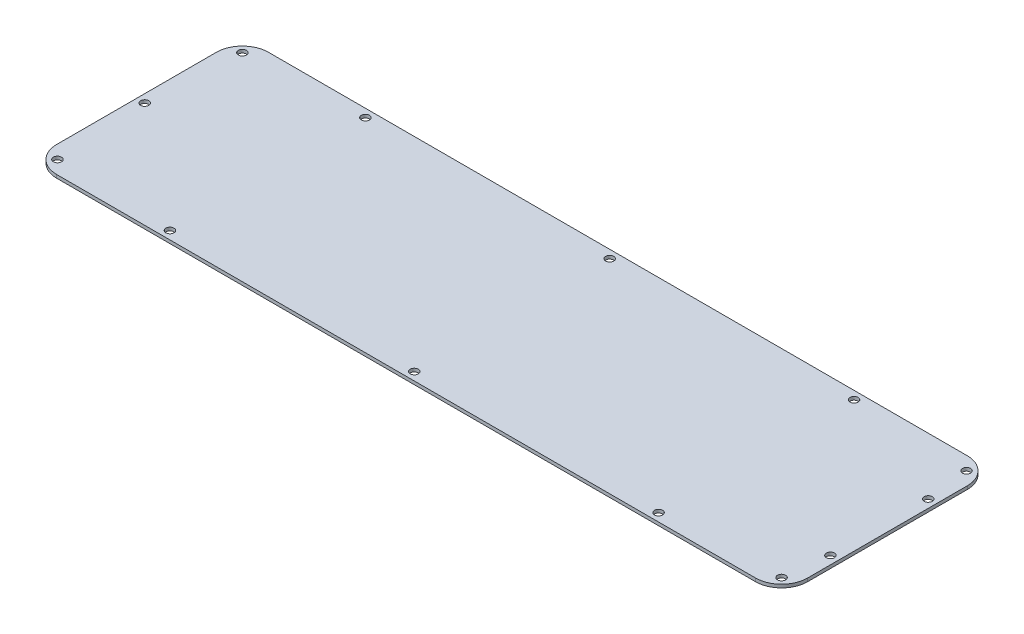
ISO-10303-21;
HEADER;
FILE_DESCRIPTION(('STEP AP214'),'2;1');
FILE_NAME('part.step','',(''),(''),'','','');
FILE_SCHEMA(('AUTOMOTIVE_DESIGN { 1 0 10303 214 1 1 1 1 }'));
ENDSEC;
DATA;
#1=APPLICATION_CONTEXT('core data for automotive mechanical design processes');
#2=APPLICATION_PROTOCOL_DEFINITION('international standard','automotive_design',2000,#1);
#3=PRODUCT_CONTEXT('',#1,'mechanical');
#4=PRODUCT('Part','Part','',(#3));
#5=PRODUCT_RELATED_PRODUCT_CATEGORY('part','',(#4));
#6=PRODUCT_DEFINITION_FORMATION('','',#4);
#7=PRODUCT_DEFINITION_CONTEXT('part definition',#1,'design');
#8=PRODUCT_DEFINITION('design','',#6,#7);
#9=PRODUCT_DEFINITION_SHAPE('','',#8);
#10=(LENGTH_UNIT() NAMED_UNIT(*) SI_UNIT(.MILLI.,.METRE.));
#11=(NAMED_UNIT(*) PLANE_ANGLE_UNIT() SI_UNIT($,.RADIAN.));
#12=(NAMED_UNIT(*) SI_UNIT($,.STERADIAN.) SOLID_ANGLE_UNIT());
#13=UNCERTAINTY_MEASURE_WITH_UNIT(LENGTH_MEASURE(1.E-05),#10,'distance_accuracy_value','');
#14=(GEOMETRIC_REPRESENTATION_CONTEXT(3) GLOBAL_UNCERTAINTY_ASSIGNED_CONTEXT((#13)) GLOBAL_UNIT_ASSIGNED_CONTEXT((#10,
#11,#12)) REPRESENTATION_CONTEXT('',''));
#15=CARTESIAN_POINT('',(0.,0.,0.));
#16=DIRECTION('',(0.,0.,1.));
#17=DIRECTION('',(1.,0.,0.));
#18=AXIS2_PLACEMENT_3D('',#15,#16,#17);
#19=CARTESIAN_POINT('',(230.5,2.,-65.));
#20=DIRECTION('',(-1.,0.,0.));
#21=DIRECTION('',(0.,0.,1.));
#22=AXIS2_PLACEMENT_3D('',#19,#20,#21);
#23=PLANE('',#22);
#24=DIRECTION('',(0.,0.,-1.));
#25=VECTOR('',#24,1.);
#26=CARTESIAN_POINT('',(230.5,0.,-65.));
#27=LINE('',#26,#25);
#28=CARTESIAN_POINT('',(230.5,0.,49.));
#29=VERTEX_POINT('',#28);
#30=CARTESIAN_POINT('',(230.5,0.,-49.));
#31=VERTEX_POINT('',#30);
#32=EDGE_CURVE('E133',#29,#31,#27,.T.);
#33=ORIENTED_EDGE('',*,*,#32,.T.);
#34=DIRECTION('',(0.,-1.,0.));
#35=VECTOR('',#34,1.);
#36=CARTESIAN_POINT('',(230.5,2.,-49.));
#37=LINE('',#36,#35);
#38=CARTESIAN_POINT('',(230.5,2.,-49.));
#39=VERTEX_POINT('',#38);
#40=EDGE_CURVE('E156',#31,#39,#37,.F.);
#41=ORIENTED_EDGE('',*,*,#40,.T.);
#42=DIRECTION('',(0.,0.,-1.));
#43=VECTOR('',#42,1.);
#44=CARTESIAN_POINT('',(230.5,2.,-65.));
#45=LINE('',#44,#43);
#46=CARTESIAN_POINT('',(230.5,2.,49.));
#47=VERTEX_POINT('',#46);
#48=EDGE_CURVE('E131',#47,#39,#45,.T.);
#49=ORIENTED_EDGE('',*,*,#48,.F.);
#50=DIRECTION('',(0.,-1.,0.));
#51=VECTOR('',#50,1.);
#52=CARTESIAN_POINT('',(230.5,2.,49.));
#53=LINE('',#52,#51);
#54=EDGE_CURVE('E153',#47,#29,#53,.T.);
#55=ORIENTED_EDGE('',*,*,#54,.T.);
#56=EDGE_LOOP('',(#33,#41,#49,#55));
#57=FACE_BOUND('',#56,.T.);
#58=ADVANCED_FACE('F38',(#57),#23,.F.);
#59=CARTESIAN_POINT('',(-230.5,2.,-65.));
#60=DIRECTION('',(0.,0.,1.));
#61=DIRECTION('',(1.,0.,0.));
#62=AXIS2_PLACEMENT_3D('',#59,#60,#61);
#63=PLANE('',#62);
#64=DIRECTION('',(-1.,0.,0.));
#65=VECTOR('',#64,1.);
#66=CARTESIAN_POINT('',(-230.5,0.,-65.));
#67=LINE('',#66,#65);
#68=CARTESIAN_POINT('',(214.5,0.,-65.));
#69=VERTEX_POINT('',#68);
#70=CARTESIAN_POINT('',(-214.5,0.,-65.));
#71=VERTEX_POINT('',#70);
#72=EDGE_CURVE('E129',#69,#71,#67,.T.);
#73=ORIENTED_EDGE('',*,*,#72,.T.);
#74=DIRECTION('',(0.,-1.,0.));
#75=VECTOR('',#74,1.);
#76=CARTESIAN_POINT('',(-214.5,2.,-65.));
#77=LINE('',#76,#75);
#78=CARTESIAN_POINT('',(-214.5,2.,-65.));
#79=VERTEX_POINT('',#78);
#80=EDGE_CURVE('E108',#71,#79,#77,.F.);
#81=ORIENTED_EDGE('',*,*,#80,.T.);
#82=DIRECTION('',(-1.,0.,0.));
#83=VECTOR('',#82,1.);
#84=CARTESIAN_POINT('',(-230.5,2.,-65.));
#85=LINE('',#84,#83);
#86=CARTESIAN_POINT('',(214.5,2.,-65.));
#87=VERTEX_POINT('',#86);
#88=EDGE_CURVE('E172',#87,#79,#85,.T.);
#89=ORIENTED_EDGE('',*,*,#88,.F.);
#90=DIRECTION('',(0.,-1.,0.));
#91=VECTOR('',#90,1.);
#92=CARTESIAN_POINT('',(214.5,2.,-65.));
#93=LINE('',#92,#91);
#94=EDGE_CURVE('E113',#87,#69,#93,.T.);
#95=ORIENTED_EDGE('',*,*,#94,.T.);
#96=EDGE_LOOP('',(#73,#81,#89,#95));
#97=FACE_BOUND('',#96,.T.);
#98=ADVANCED_FACE('F293',(#97),#63,.F.);
#99=CARTESIAN_POINT('',(-230.5,2.,-65.));
#100=DIRECTION('',(1.,0.,0.));
#101=DIRECTION('',(0.,0.,-1.));
#102=AXIS2_PLACEMENT_3D('',#99,#100,#101);
#103=PLANE('',#102);
#104=DIRECTION('',(0.,0.,1.));
#105=VECTOR('',#104,1.);
#106=CARTESIAN_POINT('',(-230.5,2.,-65.));
#107=LINE('',#106,#105);
#108=CARTESIAN_POINT('',(-230.5,2.,-49.));
#109=VERTEX_POINT('',#108);
#110=CARTESIAN_POINT('',(-230.5,2.,49.));
#111=VERTEX_POINT('',#110);
#112=EDGE_CURVE('E122',#109,#111,#107,.T.);
#113=ORIENTED_EDGE('',*,*,#112,.F.);
#114=DIRECTION('',(0.,-1.,0.));
#115=VECTOR('',#114,1.);
#116=CARTESIAN_POINT('',(-230.5,2.,-49.));
#117=LINE('',#116,#115);
#118=CARTESIAN_POINT('',(-230.5,0.,-49.));
#119=VERTEX_POINT('',#118);
#120=EDGE_CURVE('E107',#109,#119,#117,.T.);
#121=ORIENTED_EDGE('',*,*,#120,.T.);
#122=DIRECTION('',(0.,0.,1.));
#123=VECTOR('',#122,1.);
#124=CARTESIAN_POINT('',(-230.5,0.,-65.));
#125=LINE('',#124,#123);
#126=CARTESIAN_POINT('',(-230.5,0.,49.));
#127=VERTEX_POINT('',#126);
#128=EDGE_CURVE('E120',#119,#127,#125,.T.);
#129=ORIENTED_EDGE('',*,*,#128,.T.);
#130=DIRECTION('',(0.,-1.,0.));
#131=VECTOR('',#130,1.);
#132=CARTESIAN_POINT('',(-230.5,2.,49.));
#133=LINE('',#132,#131);
#134=EDGE_CURVE('E124',#127,#111,#133,.F.);
#135=ORIENTED_EDGE('',*,*,#134,.T.);
#136=EDGE_LOOP('',(#113,#121,#129,#135));
#137=FACE_BOUND('',#136,.T.);
#138=ADVANCED_FACE('F119',(#137),#103,.F.);
#139=CARTESIAN_POINT('',(-230.5,2.,65.));
#140=DIRECTION('',(0.,0.,-1.));
#141=DIRECTION('',(-1.,0.,0.));
#142=AXIS2_PLACEMENT_3D('',#139,#140,#141);
#143=PLANE('',#142);
#144=DIRECTION('',(1.,0.,0.));
#145=VECTOR('',#144,1.);
#146=CARTESIAN_POINT('',(-230.5,0.,65.));
#147=LINE('',#146,#145);
#148=CARTESIAN_POINT('',(-214.5,0.,65.));
#149=VERTEX_POINT('',#148);
#150=CARTESIAN_POINT('',(214.5,0.,65.));
#151=VERTEX_POINT('',#150);
#152=EDGE_CURVE('E128',#149,#151,#147,.T.);
#153=ORIENTED_EDGE('',*,*,#152,.T.);
#154=DIRECTION('',(0.,-1.,0.));
#155=VECTOR('',#154,1.);
#156=CARTESIAN_POINT('',(214.5,2.,65.));
#157=LINE('',#156,#155);
#158=CARTESIAN_POINT('',(214.5,2.,65.));
#159=VERTEX_POINT('',#158);
#160=EDGE_CURVE('E11',#151,#159,#157,.F.);
#161=ORIENTED_EDGE('',*,*,#160,.T.);
#162=DIRECTION('',(1.,0.,0.));
#163=VECTOR('',#162,1.);
#164=CARTESIAN_POINT('',(-230.5,2.,65.));
#165=LINE('',#164,#163);
#166=CARTESIAN_POINT('',(-214.5,2.,65.));
#167=VERTEX_POINT('',#166);
#168=EDGE_CURVE('E137',#167,#159,#165,.T.);
#169=ORIENTED_EDGE('',*,*,#168,.F.);
#170=DIRECTION('',(0.,-1.,0.));
#171=VECTOR('',#170,1.);
#172=CARTESIAN_POINT('',(-214.5,2.,65.));
#173=LINE('',#172,#171);
#174=EDGE_CURVE('E46',#167,#149,#173,.T.);
#175=ORIENTED_EDGE('',*,*,#174,.T.);
#176=EDGE_LOOP('',(#153,#161,#169,#175));
#177=FACE_BOUND('',#176,.T.);
#178=ADVANCED_FACE('F159',(#177),#143,.F.);
#179=CARTESIAN_POINT('',(0.,2.,0.));
#180=DIRECTION('',(0.,1.,0.));
#181=DIRECTION('',(0.,0.,1.));
#182=AXIS2_PLACEMENT_3D('',#179,#180,#181);
#183=PLANE('',#182);
#184=CARTESIAN_POINT('',(-222.278174593052,2.,-56.778174593052));
#185=DIRECTION('',(0.,1.,0.));
#186=DIRECTION('',(0.,0.,1.));
#187=AXIS2_PLACEMENT_3D('',#184,#185,#186);
#188=CIRCLE('',#187,2.5);
#189=CARTESIAN_POINT('',(-222.278174593052,2.,-54.278174593052));
#190=VERTEX_POINT('',#189);
#191=EDGE_CURVE('E258',#190,#190,#188,.T.);
#192=ORIENTED_EDGE('',*,*,#191,.F.);
#193=EDGE_LOOP('',(#192));
#194=FACE_BOUND('',#193,.T.);
#195=CARTESIAN_POINT('',(-150.,2.,-60.));
#196=DIRECTION('',(0.,1.,0.));
#197=DIRECTION('',(0.,0.,1.));
#198=AXIS2_PLACEMENT_3D('',#195,#196,#197);
#199=CIRCLE('',#198,2.5);
#200=CARTESIAN_POINT('',(-150.,2.,-57.5));
#201=VERTEX_POINT('',#200);
#202=EDGE_CURVE('E252',#201,#201,#199,.T.);
#203=ORIENTED_EDGE('',*,*,#202,.F.);
#204=EDGE_LOOP('',(#203));
#205=FACE_BOUND('',#204,.T.);
#206=CARTESIAN_POINT('',(-225.5,2.,0.));
#207=DIRECTION('',(0.,1.,0.));
#208=DIRECTION('',(0.,0.,1.));
#209=AXIS2_PLACEMENT_3D('',#206,#207,#208);
#210=CIRCLE('',#209,2.5);
#211=CARTESIAN_POINT('',(-225.5,2.,2.5));
#212=VERTEX_POINT('',#211);
#213=EDGE_CURVE('E246',#212,#212,#210,.T.);
#214=ORIENTED_EDGE('',*,*,#213,.F.);
#215=EDGE_LOOP('',(#214));
#216=FACE_BOUND('',#215,.T.);
#217=CARTESIAN_POINT('',(-222.278174593052,2.,56.7781745930521));
#218=DIRECTION('',(0.,1.,0.));
#219=DIRECTION('',(0.,0.,1.));
#220=AXIS2_PLACEMENT_3D('',#217,#218,#219);
#221=CIRCLE('',#220,2.5);
#222=CARTESIAN_POINT('',(-222.278174593052,2.,59.2781745930521));
#223=VERTEX_POINT('',#222);
#224=EDGE_CURVE('E240',#223,#223,#221,.T.);
#225=ORIENTED_EDGE('',*,*,#224,.F.);
#226=EDGE_LOOP('',(#225));
#227=FACE_BOUND('',#226,.T.);
#228=CARTESIAN_POINT('',(-150.,2.,60.));
#229=DIRECTION('',(0.,1.,0.));
#230=DIRECTION('',(0.,0.,1.));
#231=AXIS2_PLACEMENT_3D('',#228,#229,#230);
#232=CIRCLE('',#231,2.5);
#233=CARTESIAN_POINT('',(-150.,2.,62.5));
#234=VERTEX_POINT('',#233);
#235=EDGE_CURVE('E234',#234,#234,#232,.T.);
#236=ORIENTED_EDGE('',*,*,#235,.F.);
#237=EDGE_LOOP('',(#236));
#238=FACE_BOUND('',#237,.T.);
#239=CARTESIAN_POINT('',(0.,2.,-60.));
#240=DIRECTION('',(0.,1.,0.));
#241=DIRECTION('',(0.,0.,1.));
#242=AXIS2_PLACEMENT_3D('',#239,#240,#241);
#243=CIRCLE('',#242,2.5);
#244=CARTESIAN_POINT('',(0.,2.,-57.5));
#245=VERTEX_POINT('',#244);
#246=EDGE_CURVE('E228',#245,#245,#243,.T.);
#247=ORIENTED_EDGE('',*,*,#246,.F.);
#248=EDGE_LOOP('',(#247));
#249=FACE_BOUND('',#248,.T.);
#250=CARTESIAN_POINT('',(0.,2.,60.));
#251=DIRECTION('',(0.,1.,0.));
#252=DIRECTION('',(0.,0.,1.));
#253=AXIS2_PLACEMENT_3D('',#250,#251,#252);
#254=CIRCLE('',#253,2.5);
#255=CARTESIAN_POINT('',(0.,2.,62.5));
#256=VERTEX_POINT('',#255);
#257=EDGE_CURVE('E222',#256,#256,#254,.T.);
#258=ORIENTED_EDGE('',*,*,#257,.F.);
#259=EDGE_LOOP('',(#258));
#260=FACE_BOUND('',#259,.T.);
#261=CARTESIAN_POINT('',(150.,2.,60.));
#262=DIRECTION('',(0.,1.,0.));
#263=DIRECTION('',(0.,0.,1.));
#264=AXIS2_PLACEMENT_3D('',#261,#262,#263);
#265=CIRCLE('',#264,2.5);
#266=CARTESIAN_POINT('',(150.,2.,62.5));
#267=VERTEX_POINT('',#266);
#268=EDGE_CURVE('E216',#267,#267,#265,.T.);
#269=ORIENTED_EDGE('',*,*,#268,.F.);
#270=EDGE_LOOP('',(#269));
#271=FACE_BOUND('',#270,.T.);
#272=CARTESIAN_POINT('',(150.,2.,-60.));
#273=DIRECTION('',(0.,1.,0.));
#274=DIRECTION('',(0.,0.,1.));
#275=AXIS2_PLACEMENT_3D('',#272,#273,#274);
#276=CIRCLE('',#275,2.5);
#277=CARTESIAN_POINT('',(150.,2.,-57.5));
#278=VERTEX_POINT('',#277);
#279=EDGE_CURVE('E210',#278,#278,#276,.T.);
#280=ORIENTED_EDGE('',*,*,#279,.F.);
#281=EDGE_LOOP('',(#280));
#282=FACE_BOUND('',#281,.T.);
#283=CARTESIAN_POINT('',(222.278174593052,2.,-56.778174593052));
#284=DIRECTION('',(0.,1.,0.));
#285=DIRECTION('',(0.,0.,1.));
#286=AXIS2_PLACEMENT_3D('',#283,#284,#285);
#287=CIRCLE('',#286,2.5);
#288=CARTESIAN_POINT('',(222.278174593052,2.,-54.278174593052));
#289=VERTEX_POINT('',#288);
#290=EDGE_CURVE('E204',#289,#289,#287,.T.);
#291=ORIENTED_EDGE('',*,*,#290,.F.);
#292=EDGE_LOOP('',(#291));
#293=FACE_BOUND('',#292,.T.);
#294=CARTESIAN_POINT('',(222.278174593052,2.,56.7781745930521));
#295=DIRECTION('',(0.,1.,0.));
#296=DIRECTION('',(0.,0.,1.));
#297=AXIS2_PLACEMENT_3D('',#294,#295,#296);
#298=CIRCLE('',#297,2.5);
#299=CARTESIAN_POINT('',(222.278174593052,2.,59.2781745930521));
#300=VERTEX_POINT('',#299);
#301=EDGE_CURVE('E198',#300,#300,#298,.T.);
#302=ORIENTED_EDGE('',*,*,#301,.F.);
#303=EDGE_LOOP('',(#302));
#304=FACE_BOUND('',#303,.T.);
#305=CARTESIAN_POINT('',(225.5,2.,-30.0000000000001));
#306=DIRECTION('',(0.,1.,0.));
#307=DIRECTION('',(0.,0.,1.));
#308=AXIS2_PLACEMENT_3D('',#305,#306,#307);
#309=CIRCLE('',#308,2.5);
#310=CARTESIAN_POINT('',(225.5,2.,-27.5000000000001));
#311=VERTEX_POINT('',#310);
#312=EDGE_CURVE('E190',#311,#311,#309,.T.);
#313=ORIENTED_EDGE('',*,*,#312,.F.);
#314=EDGE_LOOP('',(#313));
#315=FACE_BOUND('',#314,.T.);
#316=CARTESIAN_POINT('',(225.5,2.,30.));
#317=DIRECTION('',(0.,1.,0.));
#318=DIRECTION('',(0.,0.,1.));
#319=AXIS2_PLACEMENT_3D('',#316,#317,#318);
#320=CIRCLE('',#319,2.5);
#321=CARTESIAN_POINT('',(225.5,2.,32.5));
#322=VERTEX_POINT('',#321);
#323=EDGE_CURVE('E182',#322,#322,#320,.T.);
#324=ORIENTED_EDGE('',*,*,#323,.F.);
#325=EDGE_LOOP('',(#324));
#326=FACE_BOUND('',#325,.T.);
#327=ORIENTED_EDGE('',*,*,#88,.T.);
#328=CARTESIAN_POINT('',(-214.5,2.,-49.));
#329=DIRECTION('',(0.,1.,0.));
#330=DIRECTION('',(0.,0.,1.));
#331=AXIS2_PLACEMENT_3D('',#328,#329,#330);
#332=CIRCLE('',#331,16.);
#333=EDGE_CURVE('E151',#79,#109,#332,.T.);
#334=ORIENTED_EDGE('',*,*,#333,.T.);
#335=ORIENTED_EDGE('',*,*,#112,.T.);
#336=CARTESIAN_POINT('',(-214.5,2.,49.));
#337=DIRECTION('',(0.,1.,0.));
#338=DIRECTION('',(0.,0.,1.));
#339=AXIS2_PLACEMENT_3D('',#336,#337,#338);
#340=CIRCLE('',#339,16.);
#341=EDGE_CURVE('E58',#111,#167,#340,.T.);
#342=ORIENTED_EDGE('',*,*,#341,.T.);
#343=ORIENTED_EDGE('',*,*,#168,.T.);
#344=CARTESIAN_POINT('',(214.5,2.,49.));
#345=DIRECTION('',(0.,1.,0.));
#346=DIRECTION('',(0.,0.,1.));
#347=AXIS2_PLACEMENT_3D('',#344,#345,#346);
#348=CIRCLE('',#347,16.);
#349=EDGE_CURVE('E147',#159,#47,#348,.T.);
#350=ORIENTED_EDGE('',*,*,#349,.T.);
#351=ORIENTED_EDGE('',*,*,#48,.T.);
#352=CARTESIAN_POINT('',(214.5,2.,-49.));
#353=DIRECTION('',(0.,1.,0.));
#354=DIRECTION('',(0.,0.,1.));
#355=AXIS2_PLACEMENT_3D('',#352,#353,#354);
#356=CIRCLE('',#355,16.);
#357=EDGE_CURVE('E149',#39,#87,#356,.T.);
#358=ORIENTED_EDGE('',*,*,#357,.T.);
#359=EDGE_LOOP('',(#327,#334,#335,#342,#343,#350,#351,#358));
#360=FACE_BOUND('',#359,.T.);
#361=ADVANCED_FACE('F264',(#194,#205,#216,#227,#238,#249,#260,#271,#282,#293,#304,#315,#326,
#360),#183,.T.);
#362=CARTESIAN_POINT('',(0.,0.,0.));
#363=DIRECTION('',(0.,1.,0.));
#364=DIRECTION('',(0.,0.,1.));
#365=AXIS2_PLACEMENT_3D('',#362,#363,#364);
#366=PLANE('',#365);
#367=CARTESIAN_POINT('',(-222.278174593052,0.,-56.778174593052));
#368=DIRECTION('',(0.,1.,0.));
#369=DIRECTION('',(0.,0.,1.));
#370=AXIS2_PLACEMENT_3D('',#367,#368,#369);
#371=CIRCLE('',#370,2.5);
#372=CARTESIAN_POINT('',(-222.278174593052,0.,-54.278174593052));
#373=VERTEX_POINT('',#372);
#374=EDGE_CURVE('E255',#373,#373,#371,.T.);
#375=ORIENTED_EDGE('',*,*,#374,.T.);
#376=EDGE_LOOP('',(#375));
#377=FACE_BOUND('',#376,.T.);
#378=CARTESIAN_POINT('',(-150.,0.,-60.));
#379=DIRECTION('',(0.,1.,0.));
#380=DIRECTION('',(0.,0.,1.));
#381=AXIS2_PLACEMENT_3D('',#378,#379,#380);
#382=CIRCLE('',#381,2.5);
#383=CARTESIAN_POINT('',(-150.,0.,-57.5));
#384=VERTEX_POINT('',#383);
#385=EDGE_CURVE('E249',#384,#384,#382,.T.);
#386=ORIENTED_EDGE('',*,*,#385,.T.);
#387=EDGE_LOOP('',(#386));
#388=FACE_BOUND('',#387,.T.);
#389=CARTESIAN_POINT('',(-225.5,0.,0.));
#390=DIRECTION('',(0.,1.,0.));
#391=DIRECTION('',(0.,0.,1.));
#392=AXIS2_PLACEMENT_3D('',#389,#390,#391);
#393=CIRCLE('',#392,2.5);
#394=CARTESIAN_POINT('',(-225.5,0.,2.5));
#395=VERTEX_POINT('',#394);
#396=EDGE_CURVE('E243',#395,#395,#393,.T.);
#397=ORIENTED_EDGE('',*,*,#396,.T.);
#398=EDGE_LOOP('',(#397));
#399=FACE_BOUND('',#398,.T.);
#400=CARTESIAN_POINT('',(-222.278174593052,0.,56.7781745930521));
#401=DIRECTION('',(0.,1.,0.));
#402=DIRECTION('',(0.,0.,1.));
#403=AXIS2_PLACEMENT_3D('',#400,#401,#402);
#404=CIRCLE('',#403,2.5);
#405=CARTESIAN_POINT('',(-222.278174593052,0.,59.2781745930521));
#406=VERTEX_POINT('',#405);
#407=EDGE_CURVE('E237',#406,#406,#404,.T.);
#408=ORIENTED_EDGE('',*,*,#407,.T.);
#409=EDGE_LOOP('',(#408));
#410=FACE_BOUND('',#409,.T.);
#411=CARTESIAN_POINT('',(-150.,0.,60.));
#412=DIRECTION('',(0.,1.,0.));
#413=DIRECTION('',(0.,0.,1.));
#414=AXIS2_PLACEMENT_3D('',#411,#412,#413);
#415=CIRCLE('',#414,2.5);
#416=CARTESIAN_POINT('',(-150.,0.,62.5));
#417=VERTEX_POINT('',#416);
#418=EDGE_CURVE('E231',#417,#417,#415,.T.);
#419=ORIENTED_EDGE('',*,*,#418,.T.);
#420=EDGE_LOOP('',(#419));
#421=FACE_BOUND('',#420,.T.);
#422=CARTESIAN_POINT('',(0.,0.,-60.));
#423=DIRECTION('',(0.,1.,0.));
#424=DIRECTION('',(0.,0.,1.));
#425=AXIS2_PLACEMENT_3D('',#422,#423,#424);
#426=CIRCLE('',#425,2.5);
#427=CARTESIAN_POINT('',(0.,0.,-57.5));
#428=VERTEX_POINT('',#427);
#429=EDGE_CURVE('E225',#428,#428,#426,.T.);
#430=ORIENTED_EDGE('',*,*,#429,.T.);
#431=EDGE_LOOP('',(#430));
#432=FACE_BOUND('',#431,.T.);
#433=CARTESIAN_POINT('',(0.,0.,60.));
#434=DIRECTION('',(0.,1.,0.));
#435=DIRECTION('',(0.,0.,1.));
#436=AXIS2_PLACEMENT_3D('',#433,#434,#435);
#437=CIRCLE('',#436,2.5);
#438=CARTESIAN_POINT('',(0.,0.,62.5));
#439=VERTEX_POINT('',#438);
#440=EDGE_CURVE('E219',#439,#439,#437,.T.);
#441=ORIENTED_EDGE('',*,*,#440,.T.);
#442=EDGE_LOOP('',(#441));
#443=FACE_BOUND('',#442,.T.);
#444=CARTESIAN_POINT('',(150.,0.,60.));
#445=DIRECTION('',(0.,1.,0.));
#446=DIRECTION('',(0.,0.,1.));
#447=AXIS2_PLACEMENT_3D('',#444,#445,#446);
#448=CIRCLE('',#447,2.5);
#449=CARTESIAN_POINT('',(150.,0.,62.5));
#450=VERTEX_POINT('',#449);
#451=EDGE_CURVE('E213',#450,#450,#448,.T.);
#452=ORIENTED_EDGE('',*,*,#451,.T.);
#453=EDGE_LOOP('',(#452));
#454=FACE_BOUND('',#453,.T.);
#455=CARTESIAN_POINT('',(150.,0.,-60.));
#456=DIRECTION('',(0.,1.,0.));
#457=DIRECTION('',(0.,0.,1.));
#458=AXIS2_PLACEMENT_3D('',#455,#456,#457);
#459=CIRCLE('',#458,2.5);
#460=CARTESIAN_POINT('',(150.,0.,-57.5));
#461=VERTEX_POINT('',#460);
#462=EDGE_CURVE('E207',#461,#461,#459,.T.);
#463=ORIENTED_EDGE('',*,*,#462,.T.);
#464=EDGE_LOOP('',(#463));
#465=FACE_BOUND('',#464,.T.);
#466=CARTESIAN_POINT('',(222.278174593052,0.,-56.778174593052));
#467=DIRECTION('',(0.,1.,0.));
#468=DIRECTION('',(0.,0.,1.));
#469=AXIS2_PLACEMENT_3D('',#466,#467,#468);
#470=CIRCLE('',#469,2.5);
#471=CARTESIAN_POINT('',(222.278174593052,0.,-54.278174593052));
#472=VERTEX_POINT('',#471);
#473=EDGE_CURVE('E201',#472,#472,#470,.T.);
#474=ORIENTED_EDGE('',*,*,#473,.T.);
#475=EDGE_LOOP('',(#474));
#476=FACE_BOUND('',#475,.T.);
#477=CARTESIAN_POINT('',(222.278174593052,0.,56.7781745930521));
#478=DIRECTION('',(0.,1.,0.));
#479=DIRECTION('',(0.,0.,1.));
#480=AXIS2_PLACEMENT_3D('',#477,#478,#479);
#481=CIRCLE('',#480,2.5);
#482=CARTESIAN_POINT('',(222.278174593052,0.,59.2781745930521));
#483=VERTEX_POINT('',#482);
#484=EDGE_CURVE('E195',#483,#483,#481,.T.);
#485=ORIENTED_EDGE('',*,*,#484,.T.);
#486=EDGE_LOOP('',(#485));
#487=FACE_BOUND('',#486,.T.);
#488=CARTESIAN_POINT('',(225.5,0.,-30.0000000000001));
#489=DIRECTION('',(0.,1.,0.));
#490=DIRECTION('',(0.,0.,1.));
#491=AXIS2_PLACEMENT_3D('',#488,#489,#490);
#492=CIRCLE('',#491,2.5);
#493=CARTESIAN_POINT('',(225.5,0.,-27.5000000000001));
#494=VERTEX_POINT('',#493);
#495=EDGE_CURVE('E186',#494,#494,#492,.T.);
#496=ORIENTED_EDGE('',*,*,#495,.T.);
#497=EDGE_LOOP('',(#496));
#498=FACE_BOUND('',#497,.T.);
#499=CARTESIAN_POINT('',(225.5,0.,30.));
#500=DIRECTION('',(0.,1.,0.));
#501=DIRECTION('',(0.,0.,1.));
#502=AXIS2_PLACEMENT_3D('',#499,#500,#501);
#503=CIRCLE('',#502,2.5);
#504=CARTESIAN_POINT('',(225.5,0.,32.5));
#505=VERTEX_POINT('',#504);
#506=EDGE_CURVE('E177',#505,#505,#503,.T.);
#507=ORIENTED_EDGE('',*,*,#506,.T.);
#508=EDGE_LOOP('',(#507));
#509=FACE_BOUND('',#508,.T.);
#510=ORIENTED_EDGE('',*,*,#128,.F.);
#511=CARTESIAN_POINT('',(-214.5,0.,-49.));
#512=DIRECTION('',(0.,1.,0.));
#513=DIRECTION('',(0.,0.,1.));
#514=AXIS2_PLACEMENT_3D('',#511,#512,#513);
#515=CIRCLE('',#514,16.);
#516=EDGE_CURVE('E103',#119,#71,#515,.F.);
#517=ORIENTED_EDGE('',*,*,#516,.T.);
#518=ORIENTED_EDGE('',*,*,#72,.F.);
#519=CARTESIAN_POINT('',(214.5,0.,-49.));
#520=DIRECTION('',(0.,1.,0.));
#521=DIRECTION('',(0.,0.,1.));
#522=AXIS2_PLACEMENT_3D('',#519,#520,#521);
#523=CIRCLE('',#522,16.);
#524=EDGE_CURVE('E114',#69,#31,#523,.F.);
#525=ORIENTED_EDGE('',*,*,#524,.T.);
#526=ORIENTED_EDGE('',*,*,#32,.F.);
#527=CARTESIAN_POINT('',(214.5,0.,49.));
#528=DIRECTION('',(0.,1.,0.));
#529=DIRECTION('',(0.,0.,1.));
#530=AXIS2_PLACEMENT_3D('',#527,#528,#529);
#531=CIRCLE('',#530,16.);
#532=EDGE_CURVE('E140',#29,#151,#531,.F.);
#533=ORIENTED_EDGE('',*,*,#532,.T.);
#534=ORIENTED_EDGE('',*,*,#152,.F.);
#535=CARTESIAN_POINT('',(-214.5,0.,49.));
#536=DIRECTION('',(0.,1.,0.));
#537=DIRECTION('',(0.,0.,1.));
#538=AXIS2_PLACEMENT_3D('',#535,#536,#537);
#539=CIRCLE('',#538,16.);
#540=EDGE_CURVE('E123',#149,#127,#539,.F.);
#541=ORIENTED_EDGE('',*,*,#540,.T.);
#542=EDGE_LOOP('',(#510,#517,#518,#525,#526,#533,#534,#541));
#543=FACE_BOUND('',#542,.T.);
#544=ADVANCED_FACE('F126',(#377,#388,#399,#410,#421,#432,#443,#454,#465,#476,#487,#498,#509,
#543),#366,.F.);
#545=CARTESIAN_POINT('',(-214.5,2.,-49.));
#546=DIRECTION('',(0.,-1.,0.));
#547=DIRECTION('',(0.,0.,-1.));
#548=AXIS2_PLACEMENT_3D('',#545,#546,#547);
#549=CYLINDRICAL_SURFACE('',#548,16.);
#550=ORIENTED_EDGE('',*,*,#333,.F.);
#551=ORIENTED_EDGE('',*,*,#80,.F.);
#552=ORIENTED_EDGE('',*,*,#516,.F.);
#553=ORIENTED_EDGE('',*,*,#120,.F.);
#554=EDGE_LOOP('',(#550,#551,#552,#553));
#555=FACE_BOUND('',#554,.T.);
#556=ADVANCED_FACE('F106',(#555),#549,.T.);
#557=CARTESIAN_POINT('',(214.5,2.,-49.));
#558=DIRECTION('',(0.,-1.,0.));
#559=DIRECTION('',(0.,0.,-1.));
#560=AXIS2_PLACEMENT_3D('',#557,#558,#559);
#561=CYLINDRICAL_SURFACE('',#560,16.);
#562=ORIENTED_EDGE('',*,*,#357,.F.);
#563=ORIENTED_EDGE('',*,*,#40,.F.);
#564=ORIENTED_EDGE('',*,*,#524,.F.);
#565=ORIENTED_EDGE('',*,*,#94,.F.);
#566=EDGE_LOOP('',(#562,#563,#564,#565));
#567=FACE_BOUND('',#566,.T.);
#568=ADVANCED_FACE('F295',(#567),#561,.T.);
#569=CARTESIAN_POINT('',(214.5,2.,49.));
#570=DIRECTION('',(0.,-1.,0.));
#571=DIRECTION('',(0.,0.,-1.));
#572=AXIS2_PLACEMENT_3D('',#569,#570,#571);
#573=CYLINDRICAL_SURFACE('',#572,16.);
#574=ORIENTED_EDGE('',*,*,#349,.F.);
#575=ORIENTED_EDGE('',*,*,#160,.F.);
#576=ORIENTED_EDGE('',*,*,#532,.F.);
#577=ORIENTED_EDGE('',*,*,#54,.F.);
#578=EDGE_LOOP('',(#574,#575,#576,#577));
#579=FACE_BOUND('',#578,.T.);
#580=ADVANCED_FACE('F166',(#579),#573,.T.);
#581=CARTESIAN_POINT('',(-214.5,2.,49.));
#582=DIRECTION('',(0.,-1.,0.));
#583=DIRECTION('',(0.,0.,-1.));
#584=AXIS2_PLACEMENT_3D('',#581,#582,#583);
#585=CYLINDRICAL_SURFACE('',#584,16.);
#586=ORIENTED_EDGE('',*,*,#341,.F.);
#587=ORIENTED_EDGE('',*,*,#134,.F.);
#588=ORIENTED_EDGE('',*,*,#540,.F.);
#589=ORIENTED_EDGE('',*,*,#174,.F.);
#590=EDGE_LOOP('',(#586,#587,#588,#589));
#591=FACE_BOUND('',#590,.T.);
#592=ADVANCED_FACE('F40',(#591),#585,.T.);
#593=CARTESIAN_POINT('',(225.5,2.,30.));
#594=DIRECTION('',(0.,1.,0.));
#595=DIRECTION('',(0.,0.,1.));
#596=AXIS2_PLACEMENT_3D('',#593,#594,#595);
#597=CYLINDRICAL_SURFACE('',#596,2.5);
#598=ORIENTED_EDGE('',*,*,#506,.F.);
#599=EDGE_LOOP('',(#598));
#600=FACE_BOUND('',#599,.T.);
#601=ORIENTED_EDGE('',*,*,#323,.T.);
#602=EDGE_LOOP('',(#601));
#603=FACE_BOUND('',#602,.T.);
#604=ADVANCED_FACE('F317',(#600,#603),#597,.F.);
#605=CARTESIAN_POINT('',(225.5,2.,-30.0000000000001));
#606=DIRECTION('',(0.,1.,0.));
#607=DIRECTION('',(0.,0.,1.));
#608=AXIS2_PLACEMENT_3D('',#605,#606,#607);
#609=CYLINDRICAL_SURFACE('',#608,2.5);
#610=ORIENTED_EDGE('',*,*,#495,.F.);
#611=EDGE_LOOP('',(#610));
#612=FACE_BOUND('',#611,.T.);
#613=ORIENTED_EDGE('',*,*,#312,.T.);
#614=EDGE_LOOP('',(#613));
#615=FACE_BOUND('',#614,.T.);
#616=ADVANCED_FACE('F320',(#612,#615),#609,.F.);
#617=CARTESIAN_POINT('',(222.278174593052,2.,56.7781745930521));
#618=DIRECTION('',(0.,1.,0.));
#619=DIRECTION('',(0.,0.,1.));
#620=AXIS2_PLACEMENT_3D('',#617,#618,#619);
#621=CYLINDRICAL_SURFACE('',#620,2.5);
#622=ORIENTED_EDGE('',*,*,#484,.F.);
#623=EDGE_LOOP('',(#622));
#624=FACE_BOUND('',#623,.T.);
#625=ORIENTED_EDGE('',*,*,#301,.T.);
#626=EDGE_LOOP('',(#625));
#627=FACE_BOUND('',#626,.T.);
#628=ADVANCED_FACE('F324',(#624,#627),#621,.F.);
#629=CARTESIAN_POINT('',(222.278174593052,2.,-56.778174593052));
#630=DIRECTION('',(0.,1.,0.));
#631=DIRECTION('',(0.,0.,1.));
#632=AXIS2_PLACEMENT_3D('',#629,#630,#631);
#633=CYLINDRICAL_SURFACE('',#632,2.5);
#634=ORIENTED_EDGE('',*,*,#473,.F.);
#635=EDGE_LOOP('',(#634));
#636=FACE_BOUND('',#635,.T.);
#637=ORIENTED_EDGE('',*,*,#290,.T.);
#638=EDGE_LOOP('',(#637));
#639=FACE_BOUND('',#638,.T.);
#640=ADVANCED_FACE('F328',(#636,#639),#633,.F.);
#641=CARTESIAN_POINT('',(150.,2.,-60.));
#642=DIRECTION('',(0.,1.,0.));
#643=DIRECTION('',(0.,0.,1.));
#644=AXIS2_PLACEMENT_3D('',#641,#642,#643);
#645=CYLINDRICAL_SURFACE('',#644,2.5);
#646=ORIENTED_EDGE('',*,*,#462,.F.);
#647=EDGE_LOOP('',(#646));
#648=FACE_BOUND('',#647,.T.);
#649=ORIENTED_EDGE('',*,*,#279,.T.);
#650=EDGE_LOOP('',(#649));
#651=FACE_BOUND('',#650,.T.);
#652=ADVANCED_FACE('F332',(#648,#651),#645,.F.);
#653=CARTESIAN_POINT('',(150.,2.,60.));
#654=DIRECTION('',(0.,1.,0.));
#655=DIRECTION('',(0.,0.,1.));
#656=AXIS2_PLACEMENT_3D('',#653,#654,#655);
#657=CYLINDRICAL_SURFACE('',#656,2.5);
#658=ORIENTED_EDGE('',*,*,#451,.F.);
#659=EDGE_LOOP('',(#658));
#660=FACE_BOUND('',#659,.T.);
#661=ORIENTED_EDGE('',*,*,#268,.T.);
#662=EDGE_LOOP('',(#661));
#663=FACE_BOUND('',#662,.T.);
#664=ADVANCED_FACE('F336',(#660,#663),#657,.F.);
#665=CARTESIAN_POINT('',(0.,2.,60.));
#666=DIRECTION('',(0.,1.,0.));
#667=DIRECTION('',(0.,0.,1.));
#668=AXIS2_PLACEMENT_3D('',#665,#666,#667);
#669=CYLINDRICAL_SURFACE('',#668,2.5);
#670=ORIENTED_EDGE('',*,*,#440,.F.);
#671=EDGE_LOOP('',(#670));
#672=FACE_BOUND('',#671,.T.);
#673=ORIENTED_EDGE('',*,*,#257,.T.);
#674=EDGE_LOOP('',(#673));
#675=FACE_BOUND('',#674,.T.);
#676=ADVANCED_FACE('F340',(#672,#675),#669,.F.);
#677=CARTESIAN_POINT('',(0.,2.,-60.));
#678=DIRECTION('',(0.,1.,0.));
#679=DIRECTION('',(0.,0.,1.));
#680=AXIS2_PLACEMENT_3D('',#677,#678,#679);
#681=CYLINDRICAL_SURFACE('',#680,2.5);
#682=ORIENTED_EDGE('',*,*,#429,.F.);
#683=EDGE_LOOP('',(#682));
#684=FACE_BOUND('',#683,.T.);
#685=ORIENTED_EDGE('',*,*,#246,.T.);
#686=EDGE_LOOP('',(#685));
#687=FACE_BOUND('',#686,.T.);
#688=ADVANCED_FACE('F344',(#684,#687),#681,.F.);
#689=CARTESIAN_POINT('',(-150.,2.,60.));
#690=DIRECTION('',(0.,1.,0.));
#691=DIRECTION('',(0.,0.,1.));
#692=AXIS2_PLACEMENT_3D('',#689,#690,#691);
#693=CYLINDRICAL_SURFACE('',#692,2.5);
#694=ORIENTED_EDGE('',*,*,#418,.F.);
#695=EDGE_LOOP('',(#694));
#696=FACE_BOUND('',#695,.T.);
#697=ORIENTED_EDGE('',*,*,#235,.T.);
#698=EDGE_LOOP('',(#697));
#699=FACE_BOUND('',#698,.T.);
#700=ADVANCED_FACE('F348',(#696,#699),#693,.F.);
#701=CARTESIAN_POINT('',(-222.278174593052,2.,56.7781745930521));
#702=DIRECTION('',(0.,1.,0.));
#703=DIRECTION('',(0.,0.,1.));
#704=AXIS2_PLACEMENT_3D('',#701,#702,#703);
#705=CYLINDRICAL_SURFACE('',#704,2.5);
#706=ORIENTED_EDGE('',*,*,#407,.F.);
#707=EDGE_LOOP('',(#706));
#708=FACE_BOUND('',#707,.T.);
#709=ORIENTED_EDGE('',*,*,#224,.T.);
#710=EDGE_LOOP('',(#709));
#711=FACE_BOUND('',#710,.T.);
#712=ADVANCED_FACE('F352',(#708,#711),#705,.F.);
#713=CARTESIAN_POINT('',(-225.5,2.,0.));
#714=DIRECTION('',(0.,1.,0.));
#715=DIRECTION('',(0.,0.,1.));
#716=AXIS2_PLACEMENT_3D('',#713,#714,#715);
#717=CYLINDRICAL_SURFACE('',#716,2.5);
#718=ORIENTED_EDGE('',*,*,#396,.F.);
#719=EDGE_LOOP('',(#718));
#720=FACE_BOUND('',#719,.T.);
#721=ORIENTED_EDGE('',*,*,#213,.T.);
#722=EDGE_LOOP('',(#721));
#723=FACE_BOUND('',#722,.T.);
#724=ADVANCED_FACE('F356',(#720,#723),#717,.F.);
#725=CARTESIAN_POINT('',(-150.,2.,-60.));
#726=DIRECTION('',(0.,1.,0.));
#727=DIRECTION('',(0.,0.,1.));
#728=AXIS2_PLACEMENT_3D('',#725,#726,#727);
#729=CYLINDRICAL_SURFACE('',#728,2.5);
#730=ORIENTED_EDGE('',*,*,#385,.F.);
#731=EDGE_LOOP('',(#730));
#732=FACE_BOUND('',#731,.T.);
#733=ORIENTED_EDGE('',*,*,#202,.T.);
#734=EDGE_LOOP('',(#733));
#735=FACE_BOUND('',#734,.T.);
#736=ADVANCED_FACE('F360',(#732,#735),#729,.F.);
#737=CARTESIAN_POINT('',(-222.278174593052,2.,-56.778174593052));
#738=DIRECTION('',(0.,1.,0.));
#739=DIRECTION('',(0.,0.,1.));
#740=AXIS2_PLACEMENT_3D('',#737,#738,#739);
#741=CYLINDRICAL_SURFACE('',#740,2.5);
#742=ORIENTED_EDGE('',*,*,#374,.F.);
#743=EDGE_LOOP('',(#742));
#744=FACE_BOUND('',#743,.T.);
#745=ORIENTED_EDGE('',*,*,#191,.T.);
#746=EDGE_LOOP('',(#745));
#747=FACE_BOUND('',#746,.T.);
#748=ADVANCED_FACE('F262',(#744,#747),#741,.F.);
#749=CLOSED_SHELL('',(#58,#98,#138,#178,#361,#544,#556,#568,#580,#592,#604,#616,#628,#640,#652,
#664,#676,#688,#700,#712,#724,#736,#748));
#750=MANIFOLD_SOLID_BREP('B2',#749);
#751=ADVANCED_BREP_SHAPE_REPRESENTATION('',(#18,#750),#14);
#752=SHAPE_DEFINITION_REPRESENTATION(#9,#751);
ENDSEC;
END-ISO-10303-21;
